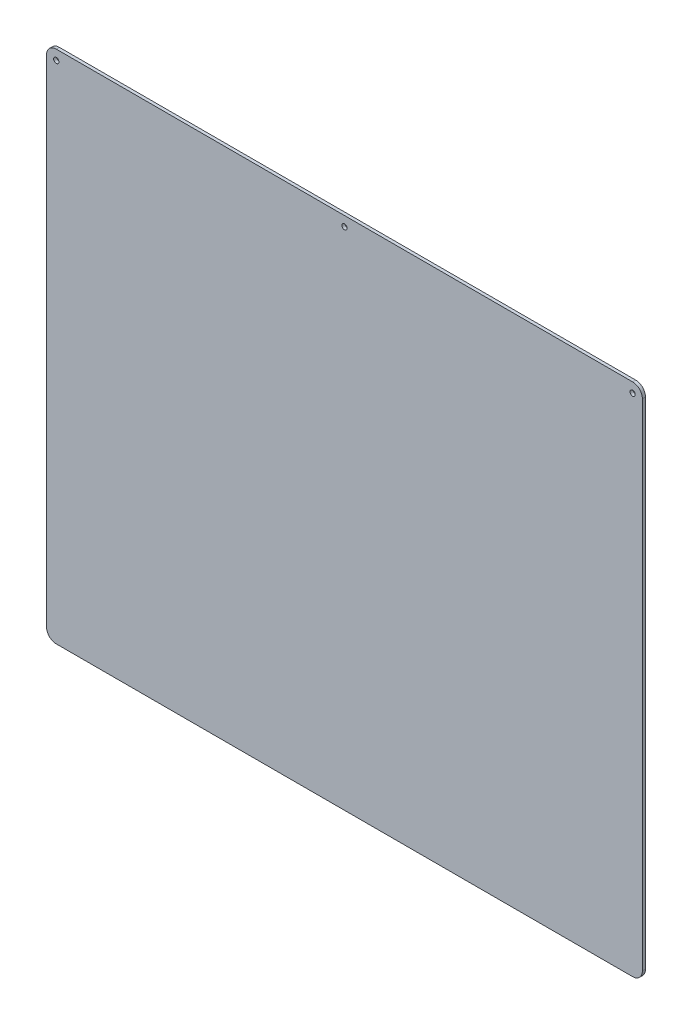
ISO-10303-21;
HEADER;
FILE_DESCRIPTION(('STEP AP214'),'2;1');
FILE_NAME('part.step','',(''),(''),'','','');
FILE_SCHEMA(('AUTOMOTIVE_DESIGN { 1 0 10303 214 1 1 1 1 }'));
ENDSEC;
DATA;
#1=APPLICATION_CONTEXT('core data for automotive mechanical design processes');
#2=APPLICATION_PROTOCOL_DEFINITION('international standard','automotive_design',2000,#1);
#3=PRODUCT_CONTEXT('',#1,'mechanical');
#4=PRODUCT('Part','Part','',(#3));
#5=PRODUCT_RELATED_PRODUCT_CATEGORY('part','',(#4));
#6=PRODUCT_DEFINITION_FORMATION('','',#4);
#7=PRODUCT_DEFINITION_CONTEXT('part definition',#1,'design');
#8=PRODUCT_DEFINITION('design','',#6,#7);
#9=PRODUCT_DEFINITION_SHAPE('','',#8);
#10=(LENGTH_UNIT() NAMED_UNIT(*) SI_UNIT(.MILLI.,.METRE.));
#11=(NAMED_UNIT(*) PLANE_ANGLE_UNIT() SI_UNIT($,.RADIAN.));
#12=(NAMED_UNIT(*) SI_UNIT($,.STERADIAN.) SOLID_ANGLE_UNIT());
#13=UNCERTAINTY_MEASURE_WITH_UNIT(LENGTH_MEASURE(1.E-05),#10,'distance_accuracy_value','');
#14=(GEOMETRIC_REPRESENTATION_CONTEXT(3) GLOBAL_UNCERTAINTY_ASSIGNED_CONTEXT((#13)) GLOBAL_UNIT_ASSIGNED_CONTEXT((#10,
#11,#12)) REPRESENTATION_CONTEXT('',''));
#15=CARTESIAN_POINT('',(0.,0.,0.));
#16=DIRECTION('',(0.,0.,1.));
#17=DIRECTION('',(1.,0.,0.));
#18=AXIS2_PLACEMENT_3D('',#15,#16,#17);
#19=CARTESIAN_POINT('',(-381.498046875056,137.467578125,3.175));
#20=DIRECTION('',(1.,0.,0.));
#21=DIRECTION('',(0.,1.,0.));
#22=AXIS2_PLACEMENT_3D('',#19,#20,#21);
#23=PLANE('',#22);
#24=DIRECTION('',(0.,-1.,0.));
#25=VECTOR('',#24,1.);
#26=CARTESIAN_POINT('',(-381.498046875056,137.467578125,0.));
#27=LINE('',#26,#25);
#28=CARTESIAN_POINT('',(-381.498046875056,127.467578125,0.));
#29=VERTEX_POINT('',#28);
#30=CARTESIAN_POINT('',(-381.498046875056,-379.508421875,0.));
#31=VERTEX_POINT('',#30);
#32=EDGE_CURVE('E164',#29,#31,#27,.T.);
#33=ORIENTED_EDGE('',*,*,#32,.T.);
#34=DIRECTION('',(0.,0.,-1.));
#35=VECTOR('',#34,1.);
#36=CARTESIAN_POINT('',(-381.498046875056,-379.508421875,3.175));
#37=LINE('',#36,#35);
#38=CARTESIAN_POINT('',(-381.498046875056,-379.508421875,3.175));
#39=VERTEX_POINT('',#38);
#40=EDGE_CURVE('E151',#31,#39,#37,.F.);
#41=ORIENTED_EDGE('',*,*,#40,.T.);
#42=DIRECTION('',(0.,-1.,0.));
#43=VECTOR('',#42,1.);
#44=CARTESIAN_POINT('',(-381.498046875056,137.467578125,3.175));
#45=LINE('',#44,#43);
#46=CARTESIAN_POINT('',(-381.498046875056,127.467578125,3.175));
#47=VERTEX_POINT('',#46);
#48=EDGE_CURVE('E166',#47,#39,#45,.T.);
#49=ORIENTED_EDGE('',*,*,#48,.F.);
#50=DIRECTION('',(0.,0.,-1.));
#51=VECTOR('',#50,1.);
#52=CARTESIAN_POINT('',(-381.498046875056,127.467578125,0.));
#53=LINE('',#52,#51);
#54=EDGE_CURVE('E148',#47,#29,#53,.T.);
#55=ORIENTED_EDGE('',*,*,#54,.T.);
#56=EDGE_LOOP('',(#33,#41,#49,#55));
#57=FACE_BOUND('',#56,.T.);
#58=ADVANCED_FACE('F39',(#57),#23,.F.);
#59=CARTESIAN_POINT('',(-381.498046875056,-389.508421875,3.175));
#60=DIRECTION('',(0.,1.,0.));
#61=DIRECTION('',(0.,0.,1.));
#62=AXIS2_PLACEMENT_3D('',#59,#60,#61);
#63=PLANE('',#62);
#64=DIRECTION('',(1.,0.,0.));
#65=VECTOR('',#64,1.);
#66=CARTESIAN_POINT('',(-381.498046875056,-389.508421875,0.));
#67=LINE('',#66,#65);
#68=CARTESIAN_POINT('',(-371.498046875056,-389.508421875,0.));
#69=VERTEX_POINT('',#68);
#70=CARTESIAN_POINT('',(218.101953124985,-389.508421875,0.));
#71=VERTEX_POINT('',#70);
#72=EDGE_CURVE('E122',#69,#71,#67,.T.);
#73=ORIENTED_EDGE('',*,*,#72,.T.);
#74=DIRECTION('',(0.,0.,-1.));
#75=VECTOR('',#74,1.);
#76=CARTESIAN_POINT('',(218.101953124985,-389.508421875,3.175));
#77=LINE('',#76,#75);
#78=CARTESIAN_POINT('',(218.101953124985,-389.508421875,3.175));
#79=VERTEX_POINT('',#78);
#80=EDGE_CURVE('E139',#71,#79,#77,.F.);
#81=ORIENTED_EDGE('',*,*,#80,.T.);
#82=DIRECTION('',(1.,0.,0.));
#83=VECTOR('',#82,1.);
#84=CARTESIAN_POINT('',(-381.498046875056,-389.508421875,3.175));
#85=LINE('',#84,#83);
#86=CARTESIAN_POINT('',(-371.498046875056,-389.508421875,3.175));
#87=VERTEX_POINT('',#86);
#88=EDGE_CURVE('E177',#87,#79,#85,.T.);
#89=ORIENTED_EDGE('',*,*,#88,.F.);
#90=DIRECTION('',(0.,0.,-1.));
#91=VECTOR('',#90,1.);
#92=CARTESIAN_POINT('',(-371.498046875056,-389.508421875,3.175));
#93=LINE('',#92,#91);
#94=EDGE_CURVE('E136',#87,#69,#93,.T.);
#95=ORIENTED_EDGE('',*,*,#94,.T.);
#96=EDGE_LOOP('',(#73,#81,#89,#95));
#97=FACE_BOUND('',#96,.T.);
#98=ADVANCED_FACE('F223',(#97),#63,.F.);
#99=CARTESIAN_POINT('',(228.101953124985,137.467578125,3.175));
#100=DIRECTION('',(1.,0.,0.));
#101=DIRECTION('',(0.,1.,0.));
#102=AXIS2_PLACEMENT_3D('',#99,#100,#101);
#103=PLANE('',#102);
#104=DIRECTION('',(0.,-1.,0.));
#105=VECTOR('',#104,1.);
#106=CARTESIAN_POINT('',(228.101953124985,137.467578125,3.175));
#107=LINE('',#106,#105);
#108=CARTESIAN_POINT('',(228.101953124985,127.467578125,3.175));
#109=VERTEX_POINT('',#108);
#110=CARTESIAN_POINT('',(228.101953124985,-379.508421875,3.175));
#111=VERTEX_POINT('',#110);
#112=EDGE_CURVE('E127',#109,#111,#107,.T.);
#113=ORIENTED_EDGE('',*,*,#112,.T.);
#114=DIRECTION('',(0.,0.,-1.));
#115=VECTOR('',#114,1.);
#116=CARTESIAN_POINT('',(228.101953124985,-379.508421875,0.));
#117=LINE('',#116,#115);
#118=CARTESIAN_POINT('',(228.101953124985,-379.508421875,0.));
#119=VERTEX_POINT('',#118);
#120=EDGE_CURVE('E114',#111,#119,#117,.T.);
#121=ORIENTED_EDGE('',*,*,#120,.T.);
#122=DIRECTION('',(0.,-1.,0.));
#123=VECTOR('',#122,1.);
#124=CARTESIAN_POINT('',(228.101953124985,137.467578125,0.));
#125=LINE('',#124,#123);
#126=CARTESIAN_POINT('',(228.101953124985,127.467578125,0.));
#127=VERTEX_POINT('',#126);
#128=EDGE_CURVE('E107',#127,#119,#125,.T.);
#129=ORIENTED_EDGE('',*,*,#128,.F.);
#130=DIRECTION('',(0.,0.,-1.));
#131=VECTOR('',#130,1.);
#132=CARTESIAN_POINT('',(228.101953124985,127.467578125,3.175));
#133=LINE('',#132,#131);
#134=EDGE_CURVE('E120',#127,#109,#133,.F.);
#135=ORIENTED_EDGE('',*,*,#134,.T.);
#136=EDGE_LOOP('',(#113,#121,#129,#135));
#137=FACE_BOUND('',#136,.T.);
#138=ADVANCED_FACE('F119',(#137),#103,.T.);
#139=CARTESIAN_POINT('',(-381.498046875056,137.467578125,3.175));
#140=DIRECTION('',(0.,1.,0.));
#141=DIRECTION('',(0.,0.,1.));
#142=AXIS2_PLACEMENT_3D('',#139,#140,#141);
#143=PLANE('',#142);
#144=DIRECTION('',(1.,0.,0.));
#145=VECTOR('',#144,1.);
#146=CARTESIAN_POINT('',(-381.498046875056,137.467578125,0.));
#147=LINE('',#146,#145);
#148=CARTESIAN_POINT('',(-371.498046875056,137.467578125,0.));
#149=VERTEX_POINT('',#148);
#150=CARTESIAN_POINT('',(218.101953124985,137.467578125,0.));
#151=VERTEX_POINT('',#150);
#152=EDGE_CURVE('E108',#149,#151,#147,.T.);
#153=ORIENTED_EDGE('',*,*,#152,.F.);
#154=DIRECTION('',(0.,0.,-1.));
#155=VECTOR('',#154,1.);
#156=CARTESIAN_POINT('',(-371.498046875056,137.467578125,3.175));
#157=LINE('',#156,#155);
#158=CARTESIAN_POINT('',(-371.498046875056,137.467578125,3.175));
#159=VERTEX_POINT('',#158);
#160=EDGE_CURVE('E11',#149,#159,#157,.F.);
#161=ORIENTED_EDGE('',*,*,#160,.T.);
#162=DIRECTION('',(1.,0.,0.));
#163=VECTOR('',#162,1.);
#164=CARTESIAN_POINT('',(-381.498046875056,137.467578125,3.175));
#165=LINE('',#164,#163);
#166=CARTESIAN_POINT('',(218.101953124985,137.467578125,3.175));
#167=VERTEX_POINT('',#166);
#168=EDGE_CURVE('E124',#159,#167,#165,.T.);
#169=ORIENTED_EDGE('',*,*,#168,.T.);
#170=DIRECTION('',(0.,0.,-1.));
#171=VECTOR('',#170,1.);
#172=CARTESIAN_POINT('',(218.101953124985,137.467578125,3.175));
#173=LINE('',#172,#171);
#174=EDGE_CURVE('E47',#167,#151,#173,.T.);
#175=ORIENTED_EDGE('',*,*,#174,.T.);
#176=EDGE_LOOP('',(#153,#161,#169,#175));
#177=FACE_BOUND('',#176,.T.);
#178=ADVANCED_FACE('F152',(#177),#143,.T.);
#179=CARTESIAN_POINT('',(0.,0.,3.175));
#180=DIRECTION('',(0.,0.,1.));
#181=DIRECTION('',(1.,0.,0.));
#182=AXIS2_PLACEMENT_3D('',#179,#180,#181);
#183=PLANE('',#182);
#184=CARTESIAN_POINT('',(-371.498046875056,127.467578125,3.175));
#185=DIRECTION('',(0.,0.,1.));
#186=DIRECTION('',(1.,0.,0.));
#187=AXIS2_PLACEMENT_3D('',#184,#185,#186);
#188=CIRCLE('',#187,2.69999999999996);
#189=CARTESIAN_POINT('',(-368.798046875056,127.467578125,3.175));
#190=VERTEX_POINT('',#189);
#191=EDGE_CURVE('E168',#190,#190,#188,.T.);
#192=ORIENTED_EDGE('',*,*,#191,.F.);
#193=EDGE_LOOP('',(#192));
#194=FACE_BOUND('',#193,.T.);
#195=CARTESIAN_POINT('',(218.101953124985,127.467578125,3.175));
#196=DIRECTION('',(0.,0.,1.));
#197=DIRECTION('',(-1.,0.,0.));
#198=AXIS2_PLACEMENT_3D('',#195,#196,#197);
#199=CIRCLE('',#198,2.70000000000001);
#200=CARTESIAN_POINT('',(220.801953124985,127.467578125,3.175));
#201=VERTEX_POINT('',#200);
#202=EDGE_CURVE('E187',#201,#201,#199,.T.);
#203=ORIENTED_EDGE('',*,*,#202,.F.);
#204=EDGE_LOOP('',(#203));
#205=FACE_BOUND('',#204,.T.);
#206=CARTESIAN_POINT('',(-76.6980468750353,127.467578125,3.175));
#207=DIRECTION('',(0.,0.,1.));
#208=DIRECTION('',(1.,0.,0.));
#209=AXIS2_PLACEMENT_3D('',#206,#207,#208);
#210=CIRCLE('',#209,2.70000000000001);
#211=CARTESIAN_POINT('',(-73.9980468750353,127.467578125,3.175));
#212=VERTEX_POINT('',#211);
#213=EDGE_CURVE('E180',#212,#212,#210,.T.);
#214=ORIENTED_EDGE('',*,*,#213,.F.);
#215=EDGE_LOOP('',(#214));
#216=FACE_BOUND('',#215,.T.);
#217=ORIENTED_EDGE('',*,*,#88,.T.);
#218=CARTESIAN_POINT('',(218.101953124985,-379.508421875,3.175));
#219=DIRECTION('',(0.,0.,1.));
#220=DIRECTION('',(1.,0.,0.));
#221=AXIS2_PLACEMENT_3D('',#218,#219,#220);
#222=CIRCLE('',#221,10.);
#223=EDGE_CURVE('E146',#79,#111,#222,.T.);
#224=ORIENTED_EDGE('',*,*,#223,.T.);
#225=ORIENTED_EDGE('',*,*,#112,.F.);
#226=CARTESIAN_POINT('',(218.101953124985,127.467578125,3.175));
#227=DIRECTION('',(0.,0.,1.));
#228=DIRECTION('',(1.,0.,0.));
#229=AXIS2_PLACEMENT_3D('',#226,#227,#228);
#230=CIRCLE('',#229,10.);
#231=EDGE_CURVE('E54',#109,#167,#230,.T.);
#232=ORIENTED_EDGE('',*,*,#231,.T.);
#233=ORIENTED_EDGE('',*,*,#168,.F.);
#234=CARTESIAN_POINT('',(-371.498046875056,127.467578125,3.175));
#235=DIRECTION('',(0.,0.,1.));
#236=DIRECTION('',(1.,0.,0.));
#237=AXIS2_PLACEMENT_3D('',#234,#235,#236);
#238=CIRCLE('',#237,10.);
#239=EDGE_CURVE('E142',#159,#47,#238,.T.);
#240=ORIENTED_EDGE('',*,*,#239,.T.);
#241=ORIENTED_EDGE('',*,*,#48,.T.);
#242=CARTESIAN_POINT('',(-371.498046875056,-379.508421875,3.175));
#243=DIRECTION('',(0.,0.,1.));
#244=DIRECTION('',(1.,0.,0.));
#245=AXIS2_PLACEMENT_3D('',#242,#243,#244);
#246=CIRCLE('',#245,10.);
#247=EDGE_CURVE('E144',#39,#87,#246,.T.);
#248=ORIENTED_EDGE('',*,*,#247,.T.);
#249=EDGE_LOOP('',(#217,#224,#225,#232,#233,#240,#241,#248));
#250=FACE_BOUND('',#249,.T.);
#251=ADVANCED_FACE('F155',(#194,#205,#216,#250),#183,.T.);
#252=CARTESIAN_POINT('',(0.,0.,0.));
#253=DIRECTION('',(0.,0.,1.));
#254=DIRECTION('',(1.,0.,0.));
#255=AXIS2_PLACEMENT_3D('',#252,#253,#254);
#256=PLANE('',#255);
#257=CARTESIAN_POINT('',(-371.498046875056,127.467578125,0.));
#258=DIRECTION('',(0.,0.,1.));
#259=DIRECTION('',(1.,0.,0.));
#260=AXIS2_PLACEMENT_3D('',#257,#258,#259);
#261=CIRCLE('',#260,2.69999999999996);
#262=CARTESIAN_POINT('',(-368.798046875056,127.467578125,0.));
#263=VERTEX_POINT('',#262);
#264=EDGE_CURVE('E173',#263,#263,#261,.F.);
#265=ORIENTED_EDGE('',*,*,#264,.F.);
#266=EDGE_LOOP('',(#265));
#267=FACE_BOUND('',#266,.T.);
#268=CARTESIAN_POINT('',(218.101953124985,127.467578125,0.));
#269=DIRECTION('',(0.,0.,1.));
#270=DIRECTION('',(1.,0.,0.));
#271=AXIS2_PLACEMENT_3D('',#268,#269,#270);
#272=CIRCLE('',#271,2.70000000000001);
#273=CARTESIAN_POINT('',(220.801953124985,127.467578125,0.));
#274=VERTEX_POINT('',#273);
#275=EDGE_CURVE('E183',#274,#274,#272,.F.);
#276=ORIENTED_EDGE('',*,*,#275,.F.);
#277=EDGE_LOOP('',(#276));
#278=FACE_BOUND('',#277,.T.);
#279=CARTESIAN_POINT('',(-76.6980468750353,127.467578125,0.));
#280=DIRECTION('',(0.,0.,1.));
#281=DIRECTION('',(1.,0.,0.));
#282=AXIS2_PLACEMENT_3D('',#279,#280,#281);
#283=CIRCLE('',#282,2.70000000000001);
#284=CARTESIAN_POINT('',(-73.9980468750353,127.467578125,0.));
#285=VERTEX_POINT('',#284);
#286=EDGE_CURVE('E184',#285,#285,#283,.F.);
#287=ORIENTED_EDGE('',*,*,#286,.F.);
#288=EDGE_LOOP('',(#287));
#289=FACE_BOUND('',#288,.T.);
#290=ORIENTED_EDGE('',*,*,#128,.T.);
#291=CARTESIAN_POINT('',(218.101953124985,-379.508421875,0.));
#292=DIRECTION('',(0.,0.,1.));
#293=DIRECTION('',(1.,0.,0.));
#294=AXIS2_PLACEMENT_3D('',#291,#292,#293);
#295=CIRCLE('',#294,10.);
#296=EDGE_CURVE('E134',#119,#71,#295,.F.);
#297=ORIENTED_EDGE('',*,*,#296,.T.);
#298=ORIENTED_EDGE('',*,*,#72,.F.);
#299=CARTESIAN_POINT('',(-371.498046875056,-379.508421875,0.));
#300=DIRECTION('',(0.,0.,1.));
#301=DIRECTION('',(1.,0.,0.));
#302=AXIS2_PLACEMENT_3D('',#299,#300,#301);
#303=CIRCLE('',#302,10.);
#304=EDGE_CURVE('E132',#69,#31,#303,.F.);
#305=ORIENTED_EDGE('',*,*,#304,.T.);
#306=ORIENTED_EDGE('',*,*,#32,.F.);
#307=CARTESIAN_POINT('',(-371.498046875056,127.467578125,0.));
#308=DIRECTION('',(0.,0.,1.));
#309=DIRECTION('',(1.,0.,0.));
#310=AXIS2_PLACEMENT_3D('',#307,#308,#309);
#311=CIRCLE('',#310,10.);
#312=EDGE_CURVE('E113',#29,#149,#311,.F.);
#313=ORIENTED_EDGE('',*,*,#312,.T.);
#314=ORIENTED_EDGE('',*,*,#152,.T.);
#315=CARTESIAN_POINT('',(218.101953124985,127.467578125,0.));
#316=DIRECTION('',(0.,0.,1.));
#317=DIRECTION('',(1.,0.,0.));
#318=AXIS2_PLACEMENT_3D('',#315,#316,#317);
#319=CIRCLE('',#318,10.);
#320=EDGE_CURVE('E104',#151,#127,#319,.F.);
#321=ORIENTED_EDGE('',*,*,#320,.T.);
#322=EDGE_LOOP('',(#290,#297,#298,#305,#306,#313,#314,#321));
#323=FACE_BOUND('',#322,.T.);
#324=ADVANCED_FACE('F106',(#267,#278,#289,#323),#256,.F.);
#325=CARTESIAN_POINT('',(218.101953124985,-379.508421875,3.175));
#326=DIRECTION('',(0.,0.,1.));
#327=DIRECTION('',(1.,0.,0.));
#328=AXIS2_PLACEMENT_3D('',#325,#326,#327);
#329=CYLINDRICAL_SURFACE('',#328,10.);
#330=ORIENTED_EDGE('',*,*,#223,.F.);
#331=ORIENTED_EDGE('',*,*,#80,.F.);
#332=ORIENTED_EDGE('',*,*,#296,.F.);
#333=ORIENTED_EDGE('',*,*,#120,.F.);
#334=EDGE_LOOP('',(#330,#331,#332,#333));
#335=FACE_BOUND('',#334,.T.);
#336=ADVANCED_FACE('F200',(#335),#329,.T.);
#337=CARTESIAN_POINT('',(-371.498046875056,-379.508421875,3.175));
#338=DIRECTION('',(0.,0.,-1.));
#339=DIRECTION('',(-1.,0.,0.));
#340=AXIS2_PLACEMENT_3D('',#337,#338,#339);
#341=CYLINDRICAL_SURFACE('',#340,10.);
#342=ORIENTED_EDGE('',*,*,#247,.F.);
#343=ORIENTED_EDGE('',*,*,#40,.F.);
#344=ORIENTED_EDGE('',*,*,#304,.F.);
#345=ORIENTED_EDGE('',*,*,#94,.F.);
#346=EDGE_LOOP('',(#342,#343,#344,#345));
#347=FACE_BOUND('',#346,.T.);
#348=ADVANCED_FACE('F234',(#347),#341,.T.);
#349=CARTESIAN_POINT('',(-371.498046875056,127.467578125,3.175));
#350=DIRECTION('',(0.,0.,1.));
#351=DIRECTION('',(1.,0.,0.));
#352=AXIS2_PLACEMENT_3D('',#349,#350,#351);
#353=CYLINDRICAL_SURFACE('',#352,10.);
#354=ORIENTED_EDGE('',*,*,#239,.F.);
#355=ORIENTED_EDGE('',*,*,#160,.F.);
#356=ORIENTED_EDGE('',*,*,#312,.F.);
#357=ORIENTED_EDGE('',*,*,#54,.F.);
#358=EDGE_LOOP('',(#354,#355,#356,#357));
#359=FACE_BOUND('',#358,.T.);
#360=ADVANCED_FACE('F160',(#359),#353,.T.);
#361=CARTESIAN_POINT('',(218.101953124985,127.467578125,3.175));
#362=DIRECTION('',(0.,0.,-1.));
#363=DIRECTION('',(-1.,0.,0.));
#364=AXIS2_PLACEMENT_3D('',#361,#362,#363);
#365=CYLINDRICAL_SURFACE('',#364,10.);
#366=ORIENTED_EDGE('',*,*,#231,.F.);
#367=ORIENTED_EDGE('',*,*,#134,.F.);
#368=ORIENTED_EDGE('',*,*,#320,.F.);
#369=ORIENTED_EDGE('',*,*,#174,.F.);
#370=EDGE_LOOP('',(#366,#367,#368,#369));
#371=FACE_BOUND('',#370,.T.);
#372=ADVANCED_FACE('F41',(#371),#365,.T.);
#373=CARTESIAN_POINT('',(-76.6980468750353,127.467578125,-11.3648581161403));
#374=DIRECTION('',(0.,0.,1.));
#375=DIRECTION('',(1.,0.,0.));
#376=AXIS2_PLACEMENT_3D('',#373,#374,#375);
#377=CYLINDRICAL_SURFACE('',#376,2.70000000000001);
#378=CARTESIAN_POINT('',(-73.9980468750353,127.467578125,0.));
#379=CARTESIAN_POINT('',(-73.9980468750353,127.467578125,0.0330729166666647));
#380=CARTESIAN_POINT('',(-73.9980468750353,127.467578125,0.0661458333333313));
#381=CARTESIAN_POINT('',(-73.9980468750353,127.467578125,0.132291666666665));
#382=CARTESIAN_POINT('',(-73.9980468750353,127.467578125,0.165364583333332));
#383=CARTESIAN_POINT('',(-73.9980468750353,127.467578125,0.231510416666665));
#384=CARTESIAN_POINT('',(-73.9980468750353,127.467578125,0.264583333333332));
#385=CARTESIAN_POINT('',(-73.9980468750353,127.467578125,0.330729166666665));
#386=CARTESIAN_POINT('',(-73.9980468750353,127.467578125,0.363802083333331));
#387=CARTESIAN_POINT('',(-73.9980468750353,127.467578125,0.429947916666665));
#388=CARTESIAN_POINT('',(-73.9980468750353,127.467578125,0.463020833333332));
#389=CARTESIAN_POINT('',(-73.9980468750353,127.467578125,0.529166666666666));
#390=CARTESIAN_POINT('',(-73.9980468750353,127.467578125,0.562239583333332));
#391=CARTESIAN_POINT('',(-73.9980468750353,127.467578125,0.628385416666665));
#392=CARTESIAN_POINT('',(-73.9980468750353,127.467578125,0.661458333333332));
#393=CARTESIAN_POINT('',(-73.9980468750353,127.467578125,0.727604166666665));
#394=CARTESIAN_POINT('',(-73.9980468750353,127.467578125,0.760677083333331));
#395=CARTESIAN_POINT('',(-73.9980468750353,127.467578125,0.826822916666665));
#396=CARTESIAN_POINT('',(-73.9980468750353,127.467578125,0.859895833333332));
#397=CARTESIAN_POINT('',(-73.9980468750353,127.467578125,0.926041666666665));
#398=CARTESIAN_POINT('',(-73.9980468750353,127.467578125,0.959114583333332));
#399=CARTESIAN_POINT('',(-73.9980468750353,127.467578125,1.02526041666666));
#400=CARTESIAN_POINT('',(-73.9980468750353,127.467578125,1.05833333333333));
#401=CARTESIAN_POINT('',(-73.9980468750353,127.467578125,1.12447916666666));
#402=CARTESIAN_POINT('',(-73.9980468750353,127.467578125,1.15755208333333));
#403=CARTESIAN_POINT('',(-73.9980468750353,127.467578125,1.22369791666667));
#404=CARTESIAN_POINT('',(-73.9980468750353,127.467578125,1.25677083333333));
#405=CARTESIAN_POINT('',(-73.9980468750353,127.467578125,1.32291666666666));
#406=CARTESIAN_POINT('',(-73.9980468750353,127.467578125,1.35598958333333));
#407=CARTESIAN_POINT('',(-73.9980468750353,127.467578125,1.42213541666667));
#408=CARTESIAN_POINT('',(-73.9980468750353,127.467578125,1.45520833333333));
#409=CARTESIAN_POINT('',(-73.9980468750353,127.467578125,1.52135416666667));
#410=CARTESIAN_POINT('',(-73.9980468750353,127.467578125,1.55442708333333));
#411=CARTESIAN_POINT('',(-73.9980468750353,127.467578125,1.62057291666667));
#412=CARTESIAN_POINT('',(-73.9980468750353,127.467578125,1.65364583333333));
#413=CARTESIAN_POINT('',(-73.9980468750353,127.467578125,1.71979166666667));
#414=CARTESIAN_POINT('',(-73.9980468750353,127.467578125,1.75286458333333));
#415=CARTESIAN_POINT('',(-73.9980468750353,127.467578125,1.81901041666667));
#416=CARTESIAN_POINT('',(-73.9980468750353,127.467578125,1.85208333333333));
#417=CARTESIAN_POINT('',(-73.9980468750353,127.467578125,1.91822916666667));
#418=CARTESIAN_POINT('',(-73.9980468750353,127.467578125,1.95130208333333));
#419=CARTESIAN_POINT('',(-73.9980468750353,127.467578125,2.01744791666667));
#420=CARTESIAN_POINT('',(-73.9980468750353,127.467578125,2.05052083333333));
#421=CARTESIAN_POINT('',(-73.9980468750353,127.467578125,2.11666666666667));
#422=CARTESIAN_POINT('',(-73.9980468750353,127.467578125,2.14973958333333));
#423=CARTESIAN_POINT('',(-73.9980468750353,127.467578125,2.21588541666667));
#424=CARTESIAN_POINT('',(-73.9980468750353,127.467578125,2.24895833333333));
#425=CARTESIAN_POINT('',(-73.9980468750353,127.467578125,2.31510416666667));
#426=CARTESIAN_POINT('',(-73.9980468750353,127.467578125,2.34817708333333));
#427=CARTESIAN_POINT('',(-73.9980468750353,127.467578125,2.41432291666667));
#428=CARTESIAN_POINT('',(-73.9980468750353,127.467578125,2.44739583333333));
#429=CARTESIAN_POINT('',(-73.9980468750353,127.467578125,2.51354166666667));
#430=CARTESIAN_POINT('',(-73.9980468750353,127.467578125,2.54661458333333));
#431=CARTESIAN_POINT('',(-73.9980468750353,127.467578125,2.61276041666667));
#432=CARTESIAN_POINT('',(-73.9980468750353,127.467578125,2.64583333333333));
#433=CARTESIAN_POINT('',(-73.9980468750353,127.467578125,2.71197916666667));
#434=CARTESIAN_POINT('',(-73.9980468750353,127.467578125,2.74505208333333));
#435=CARTESIAN_POINT('',(-73.9980468750353,127.467578125,2.81119791666667));
#436=CARTESIAN_POINT('',(-73.9980468750353,127.467578125,2.84427083333333));
#437=CARTESIAN_POINT('',(-73.9980468750353,127.467578125,2.91041666666667));
#438=CARTESIAN_POINT('',(-73.9980468750353,127.467578125,2.94348958333333));
#439=CARTESIAN_POINT('',(-73.9980468750353,127.467578125,3.00963541666667));
#440=CARTESIAN_POINT('',(-73.9980468750353,127.467578125,3.04270833333333));
#441=CARTESIAN_POINT('',(-73.9980468750353,127.467578125,3.10885416666667));
#442=CARTESIAN_POINT('',(-73.9980468750353,127.467578125,3.14192708333333));
#443=CARTESIAN_POINT('',(-73.9980468750353,127.467578125,3.175));
#444=B_SPLINE_CURVE_WITH_KNOTS('',3,(#378,#379,#380,#381,#382,#383,#384,#385,#386,#387,#388,
#389,#390,#391,#392,#393,#394,#395,#396,#397,#398,#399,#400,#401,#402,#403,#404,#405,#406,#407,
#408,#409,#410,#411,#412,#413,#414,#415,#416,#417,#418,#419,#420,#421,#422,#423,#424,#425,#426,
#427,#428,#429,#430,#431,#432,#433,#434,#435,#436,#437,#438,#439,#440,#441,#442,#443),
.UNSPECIFIED.,.F.,.F.,(4,2,2,2,2,2,2,2,2,2,2,2,2,2,2,2,2,2,2,2,2,2,2,2,2,2,2,2,2,2,2,2,4),(0.,
0.0992187499999995,0.198437500000001,0.29765625,0.396875,0.496093750000001,0.5953125,0.69453125,
0.793749999999999,0.892968750000001,0.9921875,1.09140625,1.190625,1.28984375,1.3890625,
1.48828125,1.5875,1.68671875,1.7859375,1.88515625,1.984375,2.08359375,2.1828125,2.28203125,
2.38125,2.48046875,2.5796875,2.67890625,2.778125,2.87734375,2.9765625,3.07578125,3.175),.UNSPECIFIED.);
#445=EDGE_CURVE('BSEAM206',#285,#212,#444,.T.);
#446=ORIENTED_EDGE('',*,*,#286,.T.);
#447=ORIENTED_EDGE('',*,*,#213,.T.);
#448=ORIENTED_EDGE('',*,*,#445,.T.);
#449=ORIENTED_EDGE('',*,*,#445,.F.);
#450=EDGE_LOOP('',(#446,#448,#447,#449));
#451=FACE_BOUND('',#450,.T.);
#452=ADVANCED_FACE('F206',(#451),#377,.F.);
#453=CARTESIAN_POINT('',(218.101953124985,127.467578125,-11.3648581161403));
#454=DIRECTION('',(0.,0.,1.));
#455=DIRECTION('',(1.,0.,0.));
#456=AXIS2_PLACEMENT_3D('',#453,#454,#455);
#457=CYLINDRICAL_SURFACE('',#456,2.70000000000001);
#458=CARTESIAN_POINT('',(220.801953124985,127.467578125,0.));
#459=CARTESIAN_POINT('',(220.801953124985,127.467578125,0.0330729166666647));
#460=CARTESIAN_POINT('',(220.801953124985,127.467578125,0.0661458333333313));
#461=CARTESIAN_POINT('',(220.801953124985,127.467578125,0.132291666666665));
#462=CARTESIAN_POINT('',(220.801953124985,127.467578125,0.165364583333332));
#463=CARTESIAN_POINT('',(220.801953124985,127.467578125,0.231510416666665));
#464=CARTESIAN_POINT('',(220.801953124985,127.467578125,0.264583333333332));
#465=CARTESIAN_POINT('',(220.801953124985,127.467578125,0.330729166666665));
#466=CARTESIAN_POINT('',(220.801953124985,127.467578125,0.363802083333331));
#467=CARTESIAN_POINT('',(220.801953124985,127.467578125,0.429947916666665));
#468=CARTESIAN_POINT('',(220.801953124985,127.467578125,0.463020833333332));
#469=CARTESIAN_POINT('',(220.801953124985,127.467578125,0.529166666666666));
#470=CARTESIAN_POINT('',(220.801953124985,127.467578125,0.562239583333332));
#471=CARTESIAN_POINT('',(220.801953124985,127.467578125,0.628385416666665));
#472=CARTESIAN_POINT('',(220.801953124985,127.467578125,0.661458333333332));
#473=CARTESIAN_POINT('',(220.801953124985,127.467578125,0.727604166666665));
#474=CARTESIAN_POINT('',(220.801953124985,127.467578125,0.760677083333331));
#475=CARTESIAN_POINT('',(220.801953124985,127.467578125,0.826822916666665));
#476=CARTESIAN_POINT('',(220.801953124985,127.467578125,0.859895833333332));
#477=CARTESIAN_POINT('',(220.801953124985,127.467578125,0.926041666666665));
#478=CARTESIAN_POINT('',(220.801953124985,127.467578125,0.959114583333332));
#479=CARTESIAN_POINT('',(220.801953124985,127.467578125,1.02526041666666));
#480=CARTESIAN_POINT('',(220.801953124985,127.467578125,1.05833333333333));
#481=CARTESIAN_POINT('',(220.801953124985,127.467578125,1.12447916666666));
#482=CARTESIAN_POINT('',(220.801953124985,127.467578125,1.15755208333333));
#483=CARTESIAN_POINT('',(220.801953124985,127.467578125,1.22369791666667));
#484=CARTESIAN_POINT('',(220.801953124985,127.467578125,1.25677083333333));
#485=CARTESIAN_POINT('',(220.801953124985,127.467578125,1.32291666666666));
#486=CARTESIAN_POINT('',(220.801953124985,127.467578125,1.35598958333333));
#487=CARTESIAN_POINT('',(220.801953124985,127.467578125,1.42213541666667));
#488=CARTESIAN_POINT('',(220.801953124985,127.467578125,1.45520833333333));
#489=CARTESIAN_POINT('',(220.801953124985,127.467578125,1.52135416666667));
#490=CARTESIAN_POINT('',(220.801953124985,127.467578125,1.55442708333333));
#491=CARTESIAN_POINT('',(220.801953124985,127.467578125,1.62057291666667));
#492=CARTESIAN_POINT('',(220.801953124985,127.467578125,1.65364583333333));
#493=CARTESIAN_POINT('',(220.801953124985,127.467578125,1.71979166666667));
#494=CARTESIAN_POINT('',(220.801953124985,127.467578125,1.75286458333333));
#495=CARTESIAN_POINT('',(220.801953124985,127.467578125,1.81901041666667));
#496=CARTESIAN_POINT('',(220.801953124985,127.467578125,1.85208333333333));
#497=CARTESIAN_POINT('',(220.801953124985,127.467578125,1.91822916666667));
#498=CARTESIAN_POINT('',(220.801953124985,127.467578125,1.95130208333333));
#499=CARTESIAN_POINT('',(220.801953124985,127.467578125,2.01744791666667));
#500=CARTESIAN_POINT('',(220.801953124985,127.467578125,2.05052083333333));
#501=CARTESIAN_POINT('',(220.801953124985,127.467578125,2.11666666666667));
#502=CARTESIAN_POINT('',(220.801953124985,127.467578125,2.14973958333333));
#503=CARTESIAN_POINT('',(220.801953124985,127.467578125,2.21588541666667));
#504=CARTESIAN_POINT('',(220.801953124985,127.467578125,2.24895833333333));
#505=CARTESIAN_POINT('',(220.801953124985,127.467578125,2.31510416666667));
#506=CARTESIAN_POINT('',(220.801953124985,127.467578125,2.34817708333333));
#507=CARTESIAN_POINT('',(220.801953124985,127.467578125,2.41432291666667));
#508=CARTESIAN_POINT('',(220.801953124985,127.467578125,2.44739583333333));
#509=CARTESIAN_POINT('',(220.801953124985,127.467578125,2.51354166666667));
#510=CARTESIAN_POINT('',(220.801953124985,127.467578125,2.54661458333333));
#511=CARTESIAN_POINT('',(220.801953124985,127.467578125,2.61276041666667));
#512=CARTESIAN_POINT('',(220.801953124985,127.467578125,2.64583333333333));
#513=CARTESIAN_POINT('',(220.801953124985,127.467578125,2.71197916666667));
#514=CARTESIAN_POINT('',(220.801953124985,127.467578125,2.74505208333333));
#515=CARTESIAN_POINT('',(220.801953124985,127.467578125,2.81119791666667));
#516=CARTESIAN_POINT('',(220.801953124985,127.467578125,2.84427083333333));
#517=CARTESIAN_POINT('',(220.801953124985,127.467578125,2.91041666666667));
#518=CARTESIAN_POINT('',(220.801953124985,127.467578125,2.94348958333333));
#519=CARTESIAN_POINT('',(220.801953124985,127.467578125,3.00963541666667));
#520=CARTESIAN_POINT('',(220.801953124985,127.467578125,3.04270833333333));
#521=CARTESIAN_POINT('',(220.801953124985,127.467578125,3.10885416666667));
#522=CARTESIAN_POINT('',(220.801953124985,127.467578125,3.14192708333333));
#523=CARTESIAN_POINT('',(220.801953124985,127.467578125,3.175));
#524=B_SPLINE_CURVE_WITH_KNOTS('',3,(#458,#459,#460,#461,#462,#463,#464,#465,#466,#467,#468,
#469,#470,#471,#472,#473,#474,#475,#476,#477,#478,#479,#480,#481,#482,#483,#484,#485,#486,#487,
#488,#489,#490,#491,#492,#493,#494,#495,#496,#497,#498,#499,#500,#501,#502,#503,#504,#505,#506,
#507,#508,#509,#510,#511,#512,#513,#514,#515,#516,#517,#518,#519,#520,#521,#522,#523),
.UNSPECIFIED.,.F.,.F.,(4,2,2,2,2,2,2,2,2,2,2,2,2,2,2,2,2,2,2,2,2,2,2,2,2,2,2,2,2,2,2,2,4),(0.,
0.0992187499999995,0.198437500000001,0.29765625,0.396875,0.496093750000001,0.5953125,0.69453125,
0.793749999999999,0.892968750000001,0.9921875,1.09140625,1.190625,1.28984375,1.3890625,
1.48828125,1.5875,1.68671875,1.7859375,1.88515625,1.984375,2.08359375,2.1828125,2.28203125,
2.38125,2.48046875,2.5796875,2.67890625,2.778125,2.87734375,2.9765625,3.07578125,3.175),.UNSPECIFIED.);
#525=EDGE_CURVE('BSEAM209',#274,#201,#524,.T.);
#526=ORIENTED_EDGE('',*,*,#275,.T.);
#527=ORIENTED_EDGE('',*,*,#202,.T.);
#528=ORIENTED_EDGE('',*,*,#525,.T.);
#529=ORIENTED_EDGE('',*,*,#525,.F.);
#530=EDGE_LOOP('',(#526,#528,#527,#529));
#531=FACE_BOUND('',#530,.T.);
#532=ADVANCED_FACE('F209',(#531),#457,.F.);
#533=CARTESIAN_POINT('',(-371.498046875056,127.467578125,-11.3648581161403));
#534=DIRECTION('',(0.,0.,1.));
#535=DIRECTION('',(1.,0.,0.));
#536=AXIS2_PLACEMENT_3D('',#533,#534,#535);
#537=CYLINDRICAL_SURFACE('',#536,2.69999999999996);
#538=CARTESIAN_POINT('',(-368.798046875056,127.467578125,0.));
#539=CARTESIAN_POINT('',(-368.798046875056,127.467578125,0.0330729166666647));
#540=CARTESIAN_POINT('',(-368.798046875056,127.467578125,0.0661458333333313));
#541=CARTESIAN_POINT('',(-368.798046875056,127.467578125,0.132291666666665));
#542=CARTESIAN_POINT('',(-368.798046875056,127.467578125,0.165364583333332));
#543=CARTESIAN_POINT('',(-368.798046875056,127.467578125,0.231510416666665));
#544=CARTESIAN_POINT('',(-368.798046875056,127.467578125,0.264583333333332));
#545=CARTESIAN_POINT('',(-368.798046875056,127.467578125,0.330729166666665));
#546=CARTESIAN_POINT('',(-368.798046875056,127.467578125,0.363802083333331));
#547=CARTESIAN_POINT('',(-368.798046875056,127.467578125,0.429947916666665));
#548=CARTESIAN_POINT('',(-368.798046875056,127.467578125,0.463020833333332));
#549=CARTESIAN_POINT('',(-368.798046875056,127.467578125,0.529166666666666));
#550=CARTESIAN_POINT('',(-368.798046875056,127.467578125,0.562239583333332));
#551=CARTESIAN_POINT('',(-368.798046875056,127.467578125,0.628385416666665));
#552=CARTESIAN_POINT('',(-368.798046875056,127.467578125,0.661458333333332));
#553=CARTESIAN_POINT('',(-368.798046875056,127.467578125,0.727604166666665));
#554=CARTESIAN_POINT('',(-368.798046875056,127.467578125,0.760677083333331));
#555=CARTESIAN_POINT('',(-368.798046875056,127.467578125,0.826822916666665));
#556=CARTESIAN_POINT('',(-368.798046875056,127.467578125,0.859895833333332));
#557=CARTESIAN_POINT('',(-368.798046875056,127.467578125,0.926041666666665));
#558=CARTESIAN_POINT('',(-368.798046875056,127.467578125,0.959114583333332));
#559=CARTESIAN_POINT('',(-368.798046875056,127.467578125,1.02526041666666));
#560=CARTESIAN_POINT('',(-368.798046875056,127.467578125,1.05833333333333));
#561=CARTESIAN_POINT('',(-368.798046875056,127.467578125,1.12447916666666));
#562=CARTESIAN_POINT('',(-368.798046875056,127.467578125,1.15755208333333));
#563=CARTESIAN_POINT('',(-368.798046875056,127.467578125,1.22369791666667));
#564=CARTESIAN_POINT('',(-368.798046875056,127.467578125,1.25677083333333));
#565=CARTESIAN_POINT('',(-368.798046875056,127.467578125,1.32291666666666));
#566=CARTESIAN_POINT('',(-368.798046875056,127.467578125,1.35598958333333));
#567=CARTESIAN_POINT('',(-368.798046875056,127.467578125,1.42213541666667));
#568=CARTESIAN_POINT('',(-368.798046875056,127.467578125,1.45520833333333));
#569=CARTESIAN_POINT('',(-368.798046875056,127.467578125,1.52135416666667));
#570=CARTESIAN_POINT('',(-368.798046875056,127.467578125,1.55442708333333));
#571=CARTESIAN_POINT('',(-368.798046875056,127.467578125,1.62057291666667));
#572=CARTESIAN_POINT('',(-368.798046875056,127.467578125,1.65364583333333));
#573=CARTESIAN_POINT('',(-368.798046875056,127.467578125,1.71979166666667));
#574=CARTESIAN_POINT('',(-368.798046875056,127.467578125,1.75286458333333));
#575=CARTESIAN_POINT('',(-368.798046875056,127.467578125,1.81901041666667));
#576=CARTESIAN_POINT('',(-368.798046875056,127.467578125,1.85208333333333));
#577=CARTESIAN_POINT('',(-368.798046875056,127.467578125,1.91822916666667));
#578=CARTESIAN_POINT('',(-368.798046875056,127.467578125,1.95130208333333));
#579=CARTESIAN_POINT('',(-368.798046875056,127.467578125,2.01744791666667));
#580=CARTESIAN_POINT('',(-368.798046875056,127.467578125,2.05052083333333));
#581=CARTESIAN_POINT('',(-368.798046875056,127.467578125,2.11666666666667));
#582=CARTESIAN_POINT('',(-368.798046875056,127.467578125,2.14973958333333));
#583=CARTESIAN_POINT('',(-368.798046875056,127.467578125,2.21588541666667));
#584=CARTESIAN_POINT('',(-368.798046875056,127.467578125,2.24895833333333));
#585=CARTESIAN_POINT('',(-368.798046875056,127.467578125,2.31510416666667));
#586=CARTESIAN_POINT('',(-368.798046875056,127.467578125,2.34817708333333));
#587=CARTESIAN_POINT('',(-368.798046875056,127.467578125,2.41432291666667));
#588=CARTESIAN_POINT('',(-368.798046875056,127.467578125,2.44739583333333));
#589=CARTESIAN_POINT('',(-368.798046875056,127.467578125,2.51354166666667));
#590=CARTESIAN_POINT('',(-368.798046875056,127.467578125,2.54661458333333));
#591=CARTESIAN_POINT('',(-368.798046875056,127.467578125,2.61276041666667));
#592=CARTESIAN_POINT('',(-368.798046875056,127.467578125,2.64583333333333));
#593=CARTESIAN_POINT('',(-368.798046875056,127.467578125,2.71197916666667));
#594=CARTESIAN_POINT('',(-368.798046875056,127.467578125,2.74505208333333));
#595=CARTESIAN_POINT('',(-368.798046875056,127.467578125,2.81119791666667));
#596=CARTESIAN_POINT('',(-368.798046875056,127.467578125,2.84427083333333));
#597=CARTESIAN_POINT('',(-368.798046875056,127.467578125,2.91041666666667));
#598=CARTESIAN_POINT('',(-368.798046875056,127.467578125,2.94348958333333));
#599=CARTESIAN_POINT('',(-368.798046875056,127.467578125,3.00963541666667));
#600=CARTESIAN_POINT('',(-368.798046875056,127.467578125,3.04270833333333));
#601=CARTESIAN_POINT('',(-368.798046875056,127.467578125,3.10885416666667));
#602=CARTESIAN_POINT('',(-368.798046875056,127.467578125,3.14192708333333));
#603=CARTESIAN_POINT('',(-368.798046875056,127.467578125,3.175));
#604=B_SPLINE_CURVE_WITH_KNOTS('',3,(#538,#539,#540,#541,#542,#543,#544,#545,#546,#547,#548,
#549,#550,#551,#552,#553,#554,#555,#556,#557,#558,#559,#560,#561,#562,#563,#564,#565,#566,#567,
#568,#569,#570,#571,#572,#573,#574,#575,#576,#577,#578,#579,#580,#581,#582,#583,#584,#585,#586,
#587,#588,#589,#590,#591,#592,#593,#594,#595,#596,#597,#598,#599,#600,#601,#602,#603),
.UNSPECIFIED.,.F.,.F.,(4,2,2,2,2,2,2,2,2,2,2,2,2,2,2,2,2,2,2,2,2,2,2,2,2,2,2,2,2,2,2,2,4),(0.,
0.0992187499999995,0.198437500000001,0.29765625,0.396875,0.496093750000001,0.5953125,0.69453125,
0.793749999999999,0.892968750000001,0.9921875,1.09140625,1.190625,1.28984375,1.3890625,
1.48828125,1.5875,1.68671875,1.7859375,1.88515625,1.984375,2.08359375,2.1828125,2.28203125,
2.38125,2.48046875,2.5796875,2.67890625,2.778125,2.87734375,2.9765625,3.07578125,3.175),.UNSPECIFIED.);
#605=EDGE_CURVE('BSEAM195',#263,#190,#604,.T.);
#606=ORIENTED_EDGE('',*,*,#264,.T.);
#607=ORIENTED_EDGE('',*,*,#191,.T.);
#608=ORIENTED_EDGE('',*,*,#605,.T.);
#609=ORIENTED_EDGE('',*,*,#605,.F.);
#610=EDGE_LOOP('',(#606,#608,#607,#609));
#611=FACE_BOUND('',#610,.T.);
#612=ADVANCED_FACE('F195',(#611),#537,.F.);
#613=CLOSED_SHELL('',(#58,#98,#138,#178,#251,#324,#336,#348,#360,#372,#452,#532,#612));
#614=MANIFOLD_SOLID_BREP('B2',#613);
#615=ADVANCED_BREP_SHAPE_REPRESENTATION('',(#18,#614),#14);
#616=SHAPE_DEFINITION_REPRESENTATION(#9,#615);
ENDSEC;
END-ISO-10303-21;
